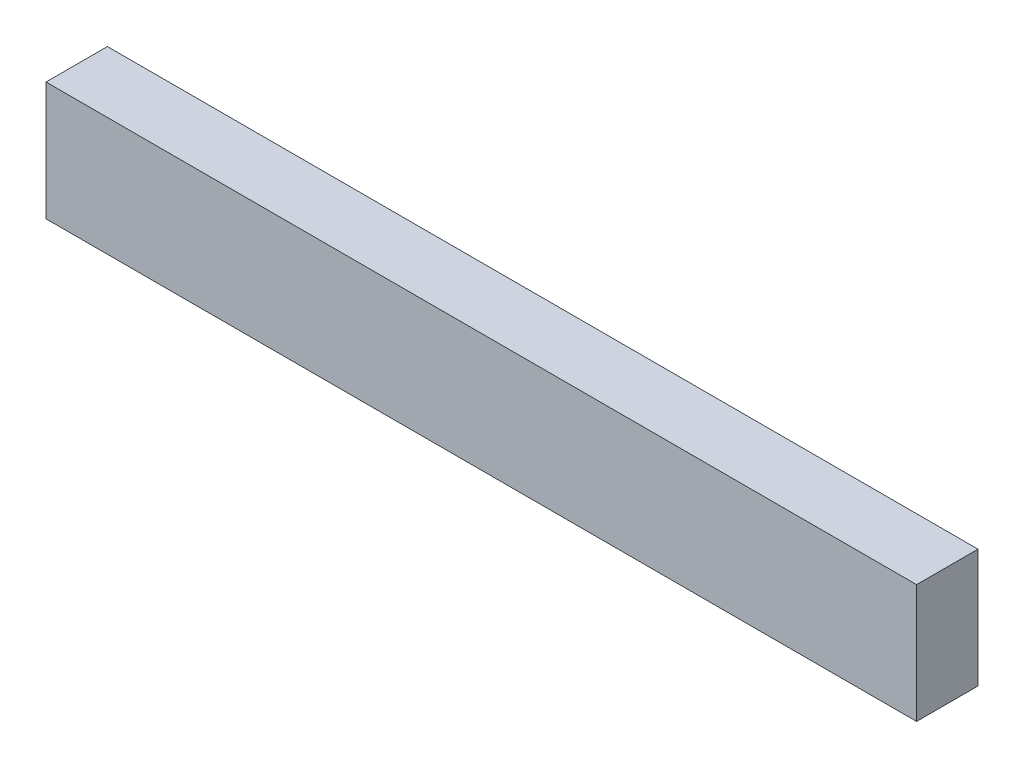
ISO-10303-21;
HEADER;
FILE_DESCRIPTION(('STEP AP214'),'2;1');
FILE_NAME('part.step','',(''),(''),'','','');
FILE_SCHEMA(('AUTOMOTIVE_DESIGN { 1 0 10303 214 1 1 1 1 }'));
ENDSEC;
DATA;
#1=APPLICATION_CONTEXT('core data for automotive mechanical design processes');
#2=APPLICATION_PROTOCOL_DEFINITION('international standard','automotive_design',2000,#1);
#3=PRODUCT_CONTEXT('',#1,'mechanical');
#4=PRODUCT('Part','Part','',(#3));
#5=PRODUCT_RELATED_PRODUCT_CATEGORY('part','',(#4));
#6=PRODUCT_DEFINITION_FORMATION('','',#4);
#7=PRODUCT_DEFINITION_CONTEXT('part definition',#1,'design');
#8=PRODUCT_DEFINITION('design','',#6,#7);
#9=PRODUCT_DEFINITION_SHAPE('','',#8);
#10=(LENGTH_UNIT() NAMED_UNIT(*) SI_UNIT(.MILLI.,.METRE.));
#11=(NAMED_UNIT(*) PLANE_ANGLE_UNIT() SI_UNIT($,.RADIAN.));
#12=(NAMED_UNIT(*) SI_UNIT($,.STERADIAN.) SOLID_ANGLE_UNIT());
#13=UNCERTAINTY_MEASURE_WITH_UNIT(LENGTH_MEASURE(1.E-05),#10,'distance_accuracy_value','');
#14=(GEOMETRIC_REPRESENTATION_CONTEXT(3) GLOBAL_UNCERTAINTY_ASSIGNED_CONTEXT((#13)) GLOBAL_UNIT_ASSIGNED_CONTEXT((#10,
#11,#12)) REPRESENTATION_CONTEXT('',''));
#15=CARTESIAN_POINT('',(0.,0.,0.));
#16=DIRECTION('',(0.,0.,1.));
#17=DIRECTION('',(1.,0.,0.));
#18=AXIS2_PLACEMENT_3D('',#15,#16,#17);
#19=CARTESIAN_POINT('',(45.,12.25,3.175));
#20=DIRECTION('',(-1.,0.,0.));
#21=DIRECTION('',(0.,0.,1.));
#22=AXIS2_PLACEMENT_3D('',#19,#20,#21);
#23=PLANE('',#22);
#24=DIRECTION('',(0.,0.,-1.));
#25=VECTOR('',#24,1.);
#26=CARTESIAN_POINT('',(45.,0.,3.175));
#27=LINE('',#26,#25);
#28=CARTESIAN_POINT('',(45.,0.,3.175));
#29=VERTEX_POINT('',#28);
#30=CARTESIAN_POINT('',(45.,0.,-3.175));
#31=VERTEX_POINT('',#30);
#32=EDGE_CURVE('E96',#29,#31,#27,.T.);
#33=ORIENTED_EDGE('',*,*,#32,.T.);
#34=DIRECTION('',(0.,-1.,0.));
#35=VECTOR('',#34,1.);
#36=CARTESIAN_POINT('',(45.,12.25,-3.175));
#37=LINE('',#36,#35);
#38=CARTESIAN_POINT('',(45.,12.25,-3.175));
#39=VERTEX_POINT('',#38);
#40=EDGE_CURVE('E11',#39,#31,#37,.T.);
#41=ORIENTED_EDGE('',*,*,#40,.F.);
#42=DIRECTION('',(0.,0.,-1.));
#43=VECTOR('',#42,1.);
#44=CARTESIAN_POINT('',(45.,12.25,3.175));
#45=LINE('',#44,#43);
#46=CARTESIAN_POINT('',(45.,12.25,3.175));
#47=VERTEX_POINT('',#46);
#48=EDGE_CURVE('E84',#47,#39,#45,.T.);
#49=ORIENTED_EDGE('',*,*,#48,.F.);
#50=DIRECTION('',(0.,-1.,0.));
#51=VECTOR('',#50,1.);
#52=CARTESIAN_POINT('',(45.,12.25,3.175));
#53=LINE('',#52,#51);
#54=EDGE_CURVE('E92',#47,#29,#53,.T.);
#55=ORIENTED_EDGE('',*,*,#54,.T.);
#56=EDGE_LOOP('',(#33,#41,#49,#55));
#57=FACE_BOUND('',#56,.T.);
#58=ADVANCED_FACE('F33',(#57),#23,.F.);
#59=CARTESIAN_POINT('',(-45.,12.25,-3.175));
#60=DIRECTION('',(0.,0.,1.));
#61=DIRECTION('',(1.,0.,0.));
#62=AXIS2_PLACEMENT_3D('',#59,#60,#61);
#63=PLANE('',#62);
#64=DIRECTION('',(-1.,0.,0.));
#65=VECTOR('',#64,1.);
#66=CARTESIAN_POINT('',(-45.,0.,-3.175));
#67=LINE('',#66,#65);
#68=CARTESIAN_POINT('',(-45.,0.,-3.175));
#69=VERTEX_POINT('',#68);
#70=EDGE_CURVE('E88',#31,#69,#67,.T.);
#71=ORIENTED_EDGE('',*,*,#70,.T.);
#72=DIRECTION('',(0.,-1.,0.));
#73=VECTOR('',#72,1.);
#74=CARTESIAN_POINT('',(-45.,12.25,-3.175));
#75=LINE('',#74,#73);
#76=CARTESIAN_POINT('',(-45.,12.25,-3.175));
#77=VERTEX_POINT('',#76);
#78=EDGE_CURVE('E41',#77,#69,#75,.T.);
#79=ORIENTED_EDGE('',*,*,#78,.F.);
#80=DIRECTION('',(-1.,0.,0.));
#81=VECTOR('',#80,1.);
#82=CARTESIAN_POINT('',(-45.,12.25,-3.175));
#83=LINE('',#82,#81);
#84=EDGE_CURVE('E79',#39,#77,#83,.T.);
#85=ORIENTED_EDGE('',*,*,#84,.F.);
#86=ORIENTED_EDGE('',*,*,#40,.T.);
#87=EDGE_LOOP('',(#71,#79,#85,#86));
#88=FACE_BOUND('',#87,.T.);
#89=ADVANCED_FACE('F87',(#88),#63,.F.);
#90=CARTESIAN_POINT('',(-45.,12.25,3.175));
#91=DIRECTION('',(1.,0.,0.));
#92=DIRECTION('',(0.,0.,-1.));
#93=AXIS2_PLACEMENT_3D('',#90,#91,#92);
#94=PLANE('',#93);
#95=DIRECTION('',(0.,0.,1.));
#96=VECTOR('',#95,1.);
#97=CARTESIAN_POINT('',(-45.,0.,3.175));
#98=LINE('',#97,#96);
#99=CARTESIAN_POINT('',(-45.,0.,3.175));
#100=VERTEX_POINT('',#99);
#101=EDGE_CURVE('E66',#69,#100,#98,.T.);
#102=ORIENTED_EDGE('',*,*,#101,.T.);
#103=DIRECTION('',(0.,-1.,0.));
#104=VECTOR('',#103,1.);
#105=CARTESIAN_POINT('',(-45.,12.25,3.175));
#106=LINE('',#105,#104);
#107=CARTESIAN_POINT('',(-45.,12.25,3.175));
#108=VERTEX_POINT('',#107);
#109=EDGE_CURVE('E89',#108,#100,#106,.T.);
#110=ORIENTED_EDGE('',*,*,#109,.F.);
#111=DIRECTION('',(0.,0.,1.));
#112=VECTOR('',#111,1.);
#113=CARTESIAN_POINT('',(-45.,12.25,3.175));
#114=LINE('',#113,#112);
#115=EDGE_CURVE('E82',#77,#108,#114,.T.);
#116=ORIENTED_EDGE('',*,*,#115,.F.);
#117=ORIENTED_EDGE('',*,*,#78,.T.);
#118=EDGE_LOOP('',(#102,#110,#116,#117));
#119=FACE_BOUND('',#118,.T.);
#120=ADVANCED_FACE('F90',(#119),#94,.F.);
#121=CARTESIAN_POINT('',(-45.,12.25,3.175));
#122=DIRECTION('',(0.,0.,-1.));
#123=DIRECTION('',(-1.,0.,0.));
#124=AXIS2_PLACEMENT_3D('',#121,#122,#123);
#125=PLANE('',#124);
#126=DIRECTION('',(1.,0.,0.));
#127=VECTOR('',#126,1.);
#128=CARTESIAN_POINT('',(-45.,0.,3.175));
#129=LINE('',#128,#127);
#130=EDGE_CURVE('E72',#100,#29,#129,.T.);
#131=ORIENTED_EDGE('',*,*,#130,.T.);
#132=ORIENTED_EDGE('',*,*,#54,.F.);
#133=DIRECTION('',(1.,0.,0.));
#134=VECTOR('',#133,1.);
#135=CARTESIAN_POINT('',(-45.,12.25,3.175));
#136=LINE('',#135,#134);
#137=EDGE_CURVE('E49',#108,#47,#136,.T.);
#138=ORIENTED_EDGE('',*,*,#137,.F.);
#139=ORIENTED_EDGE('',*,*,#109,.T.);
#140=EDGE_LOOP('',(#131,#132,#138,#139));
#141=FACE_BOUND('',#140,.T.);
#142=ADVANCED_FACE('F103',(#141),#125,.F.);
#143=CARTESIAN_POINT('',(0.,12.25,0.));
#144=DIRECTION('',(0.,-1.,0.));
#145=DIRECTION('',(0.,0.,-1.));
#146=AXIS2_PLACEMENT_3D('',#143,#144,#145);
#147=PLANE('',#146);
#148=ORIENTED_EDGE('',*,*,#48,.T.);
#149=ORIENTED_EDGE('',*,*,#84,.T.);
#150=ORIENTED_EDGE('',*,*,#115,.T.);
#151=ORIENTED_EDGE('',*,*,#137,.T.);
#152=EDGE_LOOP('',(#148,#149,#150,#151));
#153=FACE_BOUND('',#152,.T.);
#154=ADVANCED_FACE('F80',(#153),#147,.F.);
#155=CARTESIAN_POINT('',(0.,0.,0.));
#156=DIRECTION('',(0.,-1.,0.));
#157=DIRECTION('',(0.,0.,-1.));
#158=AXIS2_PLACEMENT_3D('',#155,#156,#157);
#159=PLANE('',#158);
#160=ORIENTED_EDGE('',*,*,#32,.F.);
#161=ORIENTED_EDGE('',*,*,#130,.F.);
#162=ORIENTED_EDGE('',*,*,#101,.F.);
#163=ORIENTED_EDGE('',*,*,#70,.F.);
#164=EDGE_LOOP('',(#160,#161,#162,#163));
#165=FACE_BOUND('',#164,.T.);
#166=ADVANCED_FACE('F106',(#165),#159,.T.);
#167=CLOSED_SHELL('',(#58,#89,#120,#142,#154,#166));
#168=MANIFOLD_SOLID_BREP('B2',#167);
#169=ADVANCED_BREP_SHAPE_REPRESENTATION('',(#18,#168),#14);
#170=SHAPE_DEFINITION_REPRESENTATION(#9,#169);
ENDSEC;
END-ISO-10303-21;
